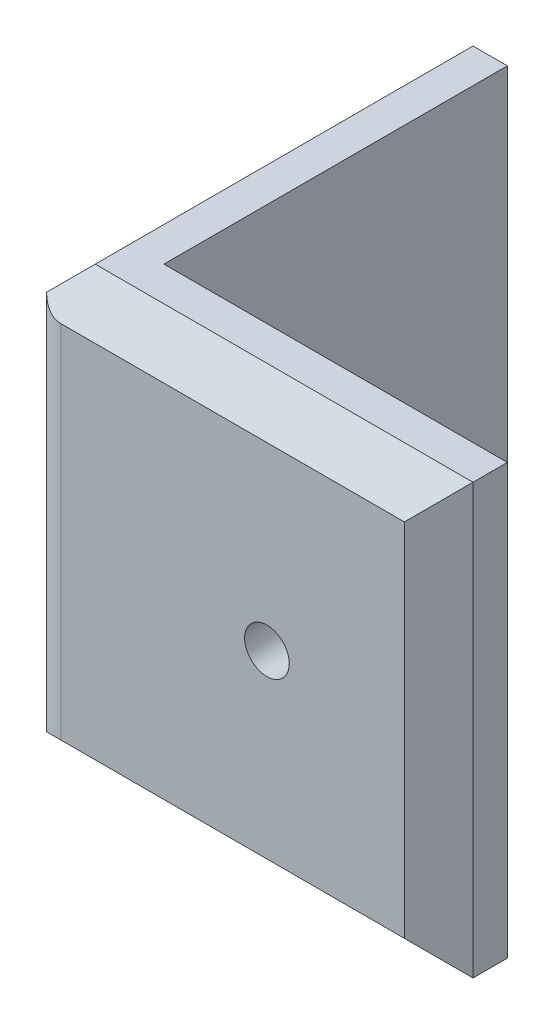
ISO-10303-21;
HEADER;
FILE_DESCRIPTION(('STEP AP214'),'2;1');
FILE_NAME('part.step','',(''),(''),'','','');
FILE_SCHEMA(('AUTOMOTIVE_DESIGN { 1 0 10303 214 1 1 1 1 }'));
ENDSEC;
DATA;
#1=APPLICATION_CONTEXT('core data for automotive mechanical design processes');
#2=APPLICATION_PROTOCOL_DEFINITION('international standard','automotive_design',2000,#1);
#3=PRODUCT_CONTEXT('',#1,'mechanical');
#4=PRODUCT('Part','Part','',(#3));
#5=PRODUCT_RELATED_PRODUCT_CATEGORY('part','',(#4));
#6=PRODUCT_DEFINITION_FORMATION('','',#4);
#7=PRODUCT_DEFINITION_CONTEXT('part definition',#1,'design');
#8=PRODUCT_DEFINITION('design','',#6,#7);
#9=PRODUCT_DEFINITION_SHAPE('','',#8);
#10=(LENGTH_UNIT() NAMED_UNIT(*) SI_UNIT(.MILLI.,.METRE.));
#11=(NAMED_UNIT(*) PLANE_ANGLE_UNIT() SI_UNIT($,.RADIAN.));
#12=(NAMED_UNIT(*) SI_UNIT($,.STERADIAN.) SOLID_ANGLE_UNIT());
#13=UNCERTAINTY_MEASURE_WITH_UNIT(LENGTH_MEASURE(1.E-05),#10,'distance_accuracy_value','');
#14=(GEOMETRIC_REPRESENTATION_CONTEXT(3) GLOBAL_UNCERTAINTY_ASSIGNED_CONTEXT((#13)) GLOBAL_UNIT_ASSIGNED_CONTEXT((#10,
#11,#12)) REPRESENTATION_CONTEXT('',''));
#15=CARTESIAN_POINT('',(0.,0.,0.));
#16=DIRECTION('',(0.,0.,1.));
#17=DIRECTION('',(1.,0.,0.));
#18=AXIS2_PLACEMENT_3D('',#15,#16,#17);
#19=CARTESIAN_POINT('',(-8.,50.,8.));
#20=DIRECTION('',(1.,0.,0.));
#21=DIRECTION('',(0.,0.,-1.));
#22=AXIS2_PLACEMENT_3D('',#19,#20,#21);
#23=PLANE('',#22);
#24=CARTESIAN_POINT('',(-8.,25.,-20.));
#25=DIRECTION('',(-1.,0.,0.));
#26=DIRECTION('',(0.,0.,1.));
#27=AXIS2_PLACEMENT_3D('',#24,#25,#26);
#28=CIRCLE('',#27,2.6);
#29=CARTESIAN_POINT('',(-8.,25.,-17.4));
#30=VERTEX_POINT('',#29);
#31=EDGE_CURVE('E190',#30,#30,#28,.T.);
#32=ORIENTED_EDGE('',*,*,#31,.F.);
#33=EDGE_LOOP('',(#32));
#34=FACE_BOUND('',#33,.T.);
#35=CARTESIAN_POINT('',(-8.,25.,-20.));
#36=DIRECTION('',(-1.,0.,0.));
#37=DIRECTION('',(0.,0.,1.));
#38=AXIS2_PLACEMENT_3D('',#35,#36,#37);
#39=CIRCLE('',#38,5.5);
#40=CARTESIAN_POINT('',(-8.,25.,-14.5));
#41=VERTEX_POINT('',#40);
#42=EDGE_CURVE('E262',#41,#41,#39,.T.);
#43=ORIENTED_EDGE('',*,*,#42,.T.);
#44=EDGE_LOOP('',(#43));
#45=FACE_BOUND('',#44,.T.);
#46=ADVANCED_FACE('F47',(#34,#45),#23,.F.);
#47=CARTESIAN_POINT('',(-8.,25.,-20.));
#48=DIRECTION('',(1.,0.,0.));
#49=DIRECTION('',(0.,0.,-1.));
#50=AXIS2_PLACEMENT_3D('',#47,#48,#49);
#51=CIRCLE('',#50,15.5693079519158);
#52=CARTESIAN_POINT('',(-8.,25.,-35.5693079519158));
#53=VERTEX_POINT('',#52);
#54=EDGE_CURVE('E199',#53,#53,#51,.T.);
#55=ORIENTED_EDGE('',*,*,#54,.T.);
#56=EDGE_LOOP('',(#55));
#57=FACE_BOUND('',#56,.T.);
#58=DIRECTION('',(0.,0.,1.));
#59=VECTOR('',#58,1.);
#60=CARTESIAN_POINT('',(-8.,4.,8.));
#61=LINE('',#60,#59);
#62=CARTESIAN_POINT('',(-8.,4.,-36.));
#63=VERTEX_POINT('',#62);
#64=CARTESIAN_POINT('',(-8.,4.,4.));
#65=VERTEX_POINT('',#64);
#66=EDGE_CURVE('E235',#63,#65,#61,.T.);
#67=ORIENTED_EDGE('',*,*,#66,.T.);
#68=DIRECTION('',(0.,-1.,0.));
#69=VECTOR('',#68,1.);
#70=CARTESIAN_POINT('',(-8.,50.,4.));
#71=LINE('',#70,#69);
#72=CARTESIAN_POINT('',(-8.,46.,4.));
#73=VERTEX_POINT('',#72);
#74=EDGE_CURVE('E70',#65,#73,#71,.F.);
#75=ORIENTED_EDGE('',*,*,#74,.T.);
#76=DIRECTION('',(0.,0.,-1.));
#77=VECTOR('',#76,1.);
#78=CARTESIAN_POINT('',(-8.,46.,8.));
#79=LINE('',#78,#77);
#80=CARTESIAN_POINT('',(-8.,46.,-36.));
#81=VERTEX_POINT('',#80);
#82=EDGE_CURVE('E232',#73,#81,#79,.T.);
#83=ORIENTED_EDGE('',*,*,#82,.T.);
#84=DIRECTION('',(0.,-1.,0.));
#85=VECTOR('',#84,1.);
#86=CARTESIAN_POINT('',(-8.,50.,-36.));
#87=LINE('',#86,#85);
#88=EDGE_CURVE('E229',#81,#63,#87,.T.);
#89=ORIENTED_EDGE('',*,*,#88,.T.);
#90=EDGE_LOOP('',(#67,#75,#83,#89));
#91=FACE_BOUND('',#90,.T.);
#92=ADVANCED_FACE('F281',(#57,#91),#23,.F.);
#93=CARTESIAN_POINT('',(40.,50.,8.));
#94=DIRECTION('',(0.,0.,-1.));
#95=DIRECTION('',(-1.,0.,0.));
#96=AXIS2_PLACEMENT_3D('',#93,#94,#95);
#97=PLANE('',#96);
#98=CARTESIAN_POINT('',(20.,25.,8.));
#99=DIRECTION('',(0.,0.,1.));
#100=DIRECTION('',(1.,0.,0.));
#101=AXIS2_PLACEMENT_3D('',#98,#99,#100);
#102=CIRCLE('',#101,2.6);
#103=CARTESIAN_POINT('',(22.6,25.,8.));
#104=VERTEX_POINT('',#103);
#105=EDGE_CURVE('E195',#104,#104,#102,.T.);
#106=ORIENTED_EDGE('',*,*,#105,.F.);
#107=EDGE_LOOP('',(#106));
#108=FACE_BOUND('',#107,.T.);
#109=DIRECTION('',(-1.,0.,0.));
#110=VECTOR('',#109,1.);
#111=CARTESIAN_POINT('',(40.,46.,8.));
#112=LINE('',#111,#110);
#113=CARTESIAN_POINT('',(36.,46.,8.));
#114=VERTEX_POINT('',#113);
#115=CARTESIAN_POINT('',(-4.,46.,8.));
#116=VERTEX_POINT('',#115);
#117=EDGE_CURVE('E206',#114,#116,#112,.T.);
#118=ORIENTED_EDGE('',*,*,#117,.T.);
#119=DIRECTION('',(0.,-1.,0.));
#120=VECTOR('',#119,1.);
#121=CARTESIAN_POINT('',(-4.,50.,8.));
#122=LINE('',#121,#120);
#123=CARTESIAN_POINT('',(-4.,4.,8.));
#124=VERTEX_POINT('',#123);
#125=EDGE_CURVE('E241',#116,#124,#122,.T.);
#126=ORIENTED_EDGE('',*,*,#125,.T.);
#127=DIRECTION('',(1.,0.,0.));
#128=VECTOR('',#127,1.);
#129=CARTESIAN_POINT('',(40.,4.,8.));
#130=LINE('',#129,#128);
#131=CARTESIAN_POINT('',(36.,4.,8.));
#132=VERTEX_POINT('',#131);
#133=EDGE_CURVE('E214',#124,#132,#130,.T.);
#134=ORIENTED_EDGE('',*,*,#133,.T.);
#135=DIRECTION('',(0.,1.,0.));
#136=VECTOR('',#135,1.);
#137=CARTESIAN_POINT('',(36.,50.,8.));
#138=LINE('',#137,#136);
#139=EDGE_CURVE('E210',#132,#114,#138,.T.);
#140=ORIENTED_EDGE('',*,*,#139,.T.);
#141=EDGE_LOOP('',(#118,#126,#134,#140));
#142=FACE_BOUND('',#141,.T.);
#143=ADVANCED_FACE('F290',(#108,#142),#97,.F.);
#144=CARTESIAN_POINT('',(40.,50.,0.));
#145=DIRECTION('',(-1.,0.,0.));
#146=DIRECTION('',(0.,0.,1.));
#147=AXIS2_PLACEMENT_3D('',#144,#145,#146);
#148=PLANE('',#147);
#149=DIRECTION('',(0.,0.,-1.));
#150=VECTOR('',#149,1.);
#151=CARTESIAN_POINT('',(40.,50.,0.));
#152=LINE('',#151,#150);
#153=CARTESIAN_POINT('',(40.,50.,4.));
#154=VERTEX_POINT('',#153);
#155=CARTESIAN_POINT('',(40.,50.,0.));
#156=VERTEX_POINT('',#155);
#157=EDGE_CURVE('E130',#154,#156,#152,.T.);
#158=ORIENTED_EDGE('',*,*,#157,.F.);
#159=DIRECTION('',(0.,-1.,0.));
#160=VECTOR('',#159,1.);
#161=CARTESIAN_POINT('',(40.,50.,4.));
#162=LINE('',#161,#160);
#163=CARTESIAN_POINT('',(40.,0.,4.));
#164=VERTEX_POINT('',#163);
#165=EDGE_CURVE('E203',#154,#164,#162,.T.);
#166=ORIENTED_EDGE('',*,*,#165,.T.);
#167=DIRECTION('',(0.,0.,-1.));
#168=VECTOR('',#167,1.);
#169=CARTESIAN_POINT('',(40.,0.,0.));
#170=LINE('',#169,#168);
#171=CARTESIAN_POINT('',(40.,0.,0.));
#172=VERTEX_POINT('',#171);
#173=EDGE_CURVE('E148',#164,#172,#170,.T.);
#174=ORIENTED_EDGE('',*,*,#173,.T.);
#175=DIRECTION('',(0.,-1.,0.));
#176=VECTOR('',#175,1.);
#177=CARTESIAN_POINT('',(40.,50.,0.));
#178=LINE('',#177,#176);
#179=EDGE_CURVE('E145',#156,#172,#178,.T.);
#180=ORIENTED_EDGE('',*,*,#179,.F.);
#181=EDGE_LOOP('',(#158,#166,#174,#180));
#182=FACE_BOUND('',#181,.T.);
#183=ADVANCED_FACE('F146',(#182),#148,.F.);
#184=CARTESIAN_POINT('',(0.,50.,0.));
#185=DIRECTION('',(0.,0.,1.));
#186=DIRECTION('',(1.,0.,0.));
#187=AXIS2_PLACEMENT_3D('',#184,#185,#186);
#188=PLANE('',#187);
#189=CARTESIAN_POINT('',(20.,25.,0.));
#190=DIRECTION('',(0.,0.,1.));
#191=DIRECTION('',(1.,0.,0.));
#192=AXIS2_PLACEMENT_3D('',#189,#190,#191);
#193=CIRCLE('',#192,2.6);
#194=CARTESIAN_POINT('',(22.6,25.,0.));
#195=VERTEX_POINT('',#194);
#196=EDGE_CURVE('E191',#195,#195,#193,.T.);
#197=ORIENTED_EDGE('',*,*,#196,.T.);
#198=EDGE_LOOP('',(#197));
#199=FACE_BOUND('',#198,.T.);
#200=DIRECTION('',(-1.,0.,0.));
#201=VECTOR('',#200,1.);
#202=CARTESIAN_POINT('',(0.,0.,0.));
#203=LINE('',#202,#201);
#204=CARTESIAN_POINT('',(0.,0.,0.));
#205=VERTEX_POINT('',#204);
#206=EDGE_CURVE('E172',#172,#205,#203,.T.);
#207=ORIENTED_EDGE('',*,*,#206,.T.);
#208=DIRECTION('',(0.,-1.,0.));
#209=VECTOR('',#208,1.);
#210=CARTESIAN_POINT('',(0.,50.,0.));
#211=LINE('',#210,#209);
#212=CARTESIAN_POINT('',(0.,50.,0.));
#213=VERTEX_POINT('',#212);
#214=EDGE_CURVE('E153',#213,#205,#211,.T.);
#215=ORIENTED_EDGE('',*,*,#214,.F.);
#216=DIRECTION('',(-1.,0.,0.));
#217=VECTOR('',#216,1.);
#218=CARTESIAN_POINT('',(0.,50.,0.));
#219=LINE('',#218,#217);
#220=EDGE_CURVE('E134',#156,#213,#219,.T.);
#221=ORIENTED_EDGE('',*,*,#220,.F.);
#222=ORIENTED_EDGE('',*,*,#179,.T.);
#223=EDGE_LOOP('',(#207,#215,#221,#222));
#224=FACE_BOUND('',#223,.T.);
#225=ADVANCED_FACE('F155',(#199,#224),#188,.F.);
#226=CARTESIAN_POINT('',(0.,50.,-40.));
#227=DIRECTION('',(-1.,0.,0.));
#228=DIRECTION('',(0.,0.,1.));
#229=AXIS2_PLACEMENT_3D('',#226,#227,#228);
#230=PLANE('',#229);
#231=CARTESIAN_POINT('',(0.,25.,-20.));
#232=DIRECTION('',(-1.,0.,0.));
#233=DIRECTION('',(0.,0.,1.));
#234=AXIS2_PLACEMENT_3D('',#231,#232,#233);
#235=CIRCLE('',#234,2.6);
#236=CARTESIAN_POINT('',(0.,25.,-17.4));
#237=VERTEX_POINT('',#236);
#238=EDGE_CURVE('E173',#237,#237,#235,.T.);
#239=ORIENTED_EDGE('',*,*,#238,.T.);
#240=EDGE_LOOP('',(#239));
#241=FACE_BOUND('',#240,.T.);
#242=DIRECTION('',(0.,0.,-1.));
#243=VECTOR('',#242,1.);
#244=CARTESIAN_POINT('',(0.,0.,-40.));
#245=LINE('',#244,#243);
#246=CARTESIAN_POINT('',(0.,0.,-40.));
#247=VERTEX_POINT('',#246);
#248=EDGE_CURVE('E176',#205,#247,#245,.T.);
#249=ORIENTED_EDGE('',*,*,#248,.T.);
#250=DIRECTION('',(0.,-1.,0.));
#251=VECTOR('',#250,1.);
#252=CARTESIAN_POINT('',(0.,50.,-40.));
#253=LINE('',#252,#251);
#254=CARTESIAN_POINT('',(0.,50.,-40.));
#255=VERTEX_POINT('',#254);
#256=EDGE_CURVE('E169',#255,#247,#253,.T.);
#257=ORIENTED_EDGE('',*,*,#256,.F.);
#258=DIRECTION('',(0.,0.,-1.));
#259=VECTOR('',#258,1.);
#260=CARTESIAN_POINT('',(0.,50.,-40.));
#261=LINE('',#260,#259);
#262=EDGE_CURVE('E159',#213,#255,#261,.T.);
#263=ORIENTED_EDGE('',*,*,#262,.F.);
#264=ORIENTED_EDGE('',*,*,#214,.T.);
#265=EDGE_LOOP('',(#249,#257,#263,#264));
#266=FACE_BOUND('',#265,.T.);
#267=ADVANCED_FACE('F305',(#241,#266),#230,.F.);
#268=CARTESIAN_POINT('',(-8.,50.,-40.));
#269=DIRECTION('',(0.,0.,1.));
#270=DIRECTION('',(1.,0.,0.));
#271=AXIS2_PLACEMENT_3D('',#268,#269,#270);
#272=PLANE('',#271);
#273=DIRECTION('',(-1.,0.,0.));
#274=VECTOR('',#273,1.);
#275=CARTESIAN_POINT('',(-8.,0.,-40.));
#276=LINE('',#275,#274);
#277=CARTESIAN_POINT('',(-4.,0.,-40.));
#278=VERTEX_POINT('',#277);
#279=EDGE_CURVE('E142',#247,#278,#276,.T.);
#280=ORIENTED_EDGE('',*,*,#279,.T.);
#281=DIRECTION('',(0.,1.,0.));
#282=VECTOR('',#281,1.);
#283=CARTESIAN_POINT('',(-4.,50.,-40.));
#284=LINE('',#283,#282);
#285=CARTESIAN_POINT('',(-4.,50.,-40.));
#286=VERTEX_POINT('',#285);
#287=EDGE_CURVE('E238',#278,#286,#284,.T.);
#288=ORIENTED_EDGE('',*,*,#287,.T.);
#289=DIRECTION('',(-1.,0.,0.));
#290=VECTOR('',#289,1.);
#291=CARTESIAN_POINT('',(-8.,50.,-40.));
#292=LINE('',#291,#290);
#293=EDGE_CURVE('E162',#255,#286,#292,.T.);
#294=ORIENTED_EDGE('',*,*,#293,.F.);
#295=ORIENTED_EDGE('',*,*,#256,.T.);
#296=EDGE_LOOP('',(#280,#288,#294,#295));
#297=FACE_BOUND('',#296,.T.);
#298=ADVANCED_FACE('F473',(#297),#272,.F.);
#299=CARTESIAN_POINT('',(0.,50.,0.));
#300=DIRECTION('',(0.,-1.,0.));
#301=DIRECTION('',(0.,0.,-1.));
#302=AXIS2_PLACEMENT_3D('',#299,#300,#301);
#303=PLANE('',#302);
#304=DIRECTION('',(0.,0.,1.));
#305=VECTOR('',#304,1.);
#306=CARTESIAN_POINT('',(-4.,50.,0.));
#307=LINE('',#306,#305);
#308=CARTESIAN_POINT('',(-3.99999999999999,50.,4.));
#309=VERTEX_POINT('',#308);
#310=EDGE_CURVE('E224',#286,#309,#307,.T.);
#311=ORIENTED_EDGE('',*,*,#310,.T.);
#312=DIRECTION('',(1.,0.,0.));
#313=VECTOR('',#312,1.);
#314=CARTESIAN_POINT('',(0.,50.,4.));
#315=LINE('',#314,#313);
#316=EDGE_CURVE('E137',#309,#154,#315,.T.);
#317=ORIENTED_EDGE('',*,*,#316,.T.);
#318=ORIENTED_EDGE('',*,*,#157,.T.);
#319=ORIENTED_EDGE('',*,*,#220,.T.);
#320=ORIENTED_EDGE('',*,*,#262,.T.);
#321=ORIENTED_EDGE('',*,*,#293,.T.);
#322=EDGE_LOOP('',(#311,#317,#318,#319,#320,#321));
#323=FACE_BOUND('',#322,.T.);
#324=ADVANCED_FACE('F132',(#323),#303,.F.);
#325=CARTESIAN_POINT('',(0.,0.,0.));
#326=DIRECTION('',(0.,-1.,0.));
#327=DIRECTION('',(0.,0.,-1.));
#328=AXIS2_PLACEMENT_3D('',#325,#326,#327);
#329=PLANE('',#328);
#330=ORIENTED_EDGE('',*,*,#173,.F.);
#331=DIRECTION('',(-1.,0.,0.));
#332=VECTOR('',#331,1.);
#333=CARTESIAN_POINT('',(-8.,0.,4.));
#334=LINE('',#333,#332);
#335=CARTESIAN_POINT('',(-3.99999999999999,0.,4.));
#336=VERTEX_POINT('',#335);
#337=EDGE_CURVE('E220',#164,#336,#334,.T.);
#338=ORIENTED_EDGE('',*,*,#337,.T.);
#339=DIRECTION('',(0.,0.,-1.));
#340=VECTOR('',#339,1.);
#341=CARTESIAN_POINT('',(-4.,0.,-40.));
#342=LINE('',#341,#340);
#343=EDGE_CURVE('E217',#336,#278,#342,.T.);
#344=ORIENTED_EDGE('',*,*,#343,.T.);
#345=ORIENTED_EDGE('',*,*,#279,.F.);
#346=ORIENTED_EDGE('',*,*,#248,.F.);
#347=ORIENTED_EDGE('',*,*,#206,.F.);
#348=EDGE_LOOP('',(#330,#338,#344,#345,#346,#347));
#349=FACE_BOUND('',#348,.T.);
#350=ADVANCED_FACE('F301',(#349),#329,.T.);
#351=CARTESIAN_POINT('',(40.,25.,-20.));
#352=DIRECTION('',(-1.,0.,0.));
#353=DIRECTION('',(0.,0.,1.));
#354=AXIS2_PLACEMENT_3D('',#351,#352,#353);
#355=CYLINDRICAL_SURFACE('',#354,2.6);
#356=ORIENTED_EDGE('',*,*,#31,.T.);
#357=EDGE_LOOP('',(#356));
#358=FACE_BOUND('',#357,.T.);
#359=ORIENTED_EDGE('',*,*,#238,.F.);
#360=EDGE_LOOP('',(#359));
#361=FACE_BOUND('',#360,.T.);
#362=ADVANCED_FACE('F448',(#358,#361),#355,.F.);
#363=CARTESIAN_POINT('',(20.,25.,-40.));
#364=DIRECTION('',(0.,0.,1.));
#365=DIRECTION('',(1.,0.,0.));
#366=AXIS2_PLACEMENT_3D('',#363,#364,#365);
#367=CYLINDRICAL_SURFACE('',#366,2.6);
#368=ORIENTED_EDGE('',*,*,#105,.T.);
#369=EDGE_LOOP('',(#368));
#370=FACE_BOUND('',#369,.T.);
#371=ORIENTED_EDGE('',*,*,#196,.F.);
#372=EDGE_LOOP('',(#371));
#373=FACE_BOUND('',#372,.T.);
#374=ADVANCED_FACE('F435',(#370,#373),#367,.F.);
#375=CARTESIAN_POINT('',(-16.,25.,-20.));
#376=DIRECTION('',(-1.,0.,0.));
#377=DIRECTION('',(0.,0.,1.));
#378=AXIS2_PLACEMENT_3D('',#375,#376,#377);
#379=PLANE('',#378);
#380=CARTESIAN_POINT('',(-16.,25.,-20.));
#381=DIRECTION('',(-1.,0.,0.));
#382=DIRECTION('',(0.,0.,1.));
#383=AXIS2_PLACEMENT_3D('',#380,#381,#382);
#384=CIRCLE('',#383,10.356406460551);
#385=CARTESIAN_POINT('',(-16.,25.,-9.64359353944899));
#386=VERTEX_POINT('',#385);
#387=EDGE_CURVE('E529',#386,#386,#384,.T.);
#388=ORIENTED_EDGE('',*,*,#387,.T.);
#389=EDGE_LOOP('',(#388));
#390=FACE_BOUND('',#389,.T.);
#391=CARTESIAN_POINT('',(-16.,25.,-20.));
#392=DIRECTION('',(-1.,0.,0.));
#393=DIRECTION('',(0.,0.,1.));
#394=AXIS2_PLACEMENT_3D('',#391,#392,#393);
#395=CIRCLE('',#394,7.64359353944899);
#396=CARTESIAN_POINT('',(-16.,25.,-12.356406460551));
#397=VERTEX_POINT('',#396);
#398=EDGE_CURVE('E533',#397,#397,#395,.T.);
#399=ORIENTED_EDGE('',*,*,#398,.F.);
#400=EDGE_LOOP('',(#399));
#401=FACE_BOUND('',#400,.T.);
#402=ADVANCED_FACE('F427',(#390,#401),#379,.T.);
#403=CARTESIAN_POINT('',(-8.,25.,-20.));
#404=DIRECTION('',(1.,0.,0.));
#405=DIRECTION('',(0.,0.,1.));
#406=AXIS2_PLACEMENT_3D('',#403,#404,#405);
#407=CONICAL_SURFACE('',#406,12.5,0.26179938779915);
#408=CARTESIAN_POINT('',(-10.9647238195899,25.,-20.));
#409=DIRECTION('',(1.,0.,0.));
#410=DIRECTION('',(0.,0.,-1.));
#411=AXIS2_PLACEMENT_3D('',#408,#409,#410);
#412=CIRCLE('',#411,11.7056046467596);
#413=CARTESIAN_POINT('',(-10.9647238195899,25.,-31.7056046467596));
#414=VERTEX_POINT('',#413);
#415=EDGE_CURVE('E152',#414,#414,#412,.F.);
#416=ORIENTED_EDGE('',*,*,#415,.T.);
#417=EDGE_LOOP('',(#416));
#418=FACE_BOUND('',#417,.T.);
#419=ORIENTED_EDGE('',*,*,#387,.F.);
#420=EDGE_LOOP('',(#419));
#421=FACE_BOUND('',#420,.T.);
#422=ADVANCED_FACE('F418',(#418,#421),#407,.T.);
#423=CARTESIAN_POINT('',(-8.,25.,-20.));
#424=DIRECTION('',(-1.,0.,0.));
#425=DIRECTION('',(0.,0.,1.));
#426=AXIS2_PLACEMENT_3D('',#423,#424,#425);
#427=CONICAL_SURFACE('',#426,5.5,0.26179938779915);
#428=ORIENTED_EDGE('',*,*,#398,.T.);
#429=EDGE_LOOP('',(#428));
#430=FACE_BOUND('',#429,.T.);
#431=ORIENTED_EDGE('',*,*,#42,.F.);
#432=EDGE_LOOP('',(#431));
#433=FACE_BOUND('',#432,.T.);
#434=ADVANCED_FACE('F338',(#430,#433),#427,.F.);
#435=CARTESIAN_POINT('',(-12.,25.,-20.));
#436=DIRECTION('',(1.,0.,0.));
#437=DIRECTION('',(0.,0.,-1.));
#438=AXIS2_PLACEMENT_3D('',#435,#436,#437);
#439=TOROIDAL_SURFACE('',#438,15.5693079519158,4.);
#440=ORIENTED_EDGE('',*,*,#54,.F.);
#441=EDGE_LOOP('',(#440));
#442=FACE_BOUND('',#441,.T.);
#443=ORIENTED_EDGE('',*,*,#415,.F.);
#444=EDGE_LOOP('',(#443));
#445=FACE_BOUND('',#444,.T.);
#446=ADVANCED_FACE('F322',(#442,#445),#439,.F.);
#447=CARTESIAN_POINT('',(-8.,50.,-36.));
#448=DIRECTION('',(0.707106781186548,0.,0.707106781186547));
#449=DIRECTION('',(0.,-1.,0.));
#450=AXIS2_PLACEMENT_3D('',#447,#448,#449);
#451=PLANE('',#450);
#452=DIRECTION('',(0.577350269189625,-0.577350269189626,-0.577350269189626));
#453=VECTOR('',#452,1.);
#454=CARTESIAN_POINT('',(-23.3333333333333,19.3333333333333,-20.6666666666666));
#455=LINE('',#454,#453);
#456=EDGE_CURVE('E254',#63,#278,#455,.T.);
#457=ORIENTED_EDGE('',*,*,#456,.F.);
#458=ORIENTED_EDGE('',*,*,#88,.F.);
#459=DIRECTION('',(0.577350269189625,0.577350269189626,-0.577350269189626));
#460=VECTOR('',#459,1.);
#461=CARTESIAN_POINT('',(-6.66666666666667,47.3333333333333,-37.3333333333333));
#462=LINE('',#461,#460);
#463=EDGE_CURVE('E258',#286,#81,#462,.F.);
#464=ORIENTED_EDGE('',*,*,#463,.F.);
#465=ORIENTED_EDGE('',*,*,#287,.F.);
#466=EDGE_LOOP('',(#457,#458,#464,#465));
#467=FACE_BOUND('',#466,.T.);
#468=ADVANCED_FACE('F313',(#467),#451,.F.);
#469=CARTESIAN_POINT('',(-4.,50.,0.));
#470=DIRECTION('',(0.707106781186547,-0.707106781186547,0.));
#471=DIRECTION('',(0.,0.,1.));
#472=AXIS2_PLACEMENT_3D('',#469,#470,#471);
#473=PLANE('',#472);
#474=ORIENTED_EDGE('',*,*,#82,.F.);
#475=CARTESIAN_POINT('',(-4.,50.,4.));
#476=DIRECTION('',(0.707106781186547,-0.707106781186547,0.));
#477=DIRECTION('',(-0.707106781186548,-0.707106781186548,0.));
#478=AXIS2_PLACEMENT_3D('',#475,#476,#477);
#479=ELLIPSE('',#478,5.65685424949238,4.);
#480=CARTESIAN_POINT('',(-6.82842712474618,47.1715728752538,6.82842712474619));
#481=VERTEX_POINT('',#480);
#482=EDGE_CURVE('E56',#73,#481,#479,.F.);
#483=ORIENTED_EDGE('',*,*,#482,.T.);
#484=DIRECTION('',(0.577350269189626,0.577350269189626,-0.577350269189626));
#485=VECTOR('',#484,1.);
#486=CARTESIAN_POINT('',(-2.66666666666666,51.3333333333333,2.66666666666667));
#487=LINE('',#486,#485);
#488=EDGE_CURVE('E251',#309,#481,#487,.F.);
#489=ORIENTED_EDGE('',*,*,#488,.F.);
#490=ORIENTED_EDGE('',*,*,#310,.F.);
#491=ORIENTED_EDGE('',*,*,#463,.T.);
#492=EDGE_LOOP('',(#474,#483,#489,#490,#491));
#493=FACE_BOUND('',#492,.T.);
#494=ADVANCED_FACE('F314',(#493),#473,.F.);
#495=CARTESIAN_POINT('',(-8.,4.,8.));
#496=DIRECTION('',(-0.707106781186547,-0.707106781186547,0.));
#497=DIRECTION('',(0.,0.,-1.));
#498=AXIS2_PLACEMENT_3D('',#495,#496,#497);
#499=PLANE('',#498);
#500=DIRECTION('',(-0.577350269189626,0.577350269189626,0.577350269189626));
#501=VECTOR('',#500,1.);
#502=CARTESIAN_POINT('',(-8.,4.,8.));
#503=LINE('',#502,#501);
#504=CARTESIAN_POINT('',(-6.82842712474619,2.82842712474619,6.82842712474619));
#505=VERTEX_POINT('',#504);
#506=EDGE_CURVE('E248',#505,#336,#503,.F.);
#507=ORIENTED_EDGE('',*,*,#506,.F.);
#508=CARTESIAN_POINT('',(-4.,0.,4.));
#509=DIRECTION('',(-0.707106781186547,-0.707106781186547,0.));
#510=DIRECTION('',(0.707106781186548,-0.707106781186548,0.));
#511=AXIS2_PLACEMENT_3D('',#508,#509,#510);
#512=ELLIPSE('',#511,5.65685424949238,4.);
#513=EDGE_CURVE('E269',#505,#65,#512,.T.);
#514=ORIENTED_EDGE('',*,*,#513,.T.);
#515=ORIENTED_EDGE('',*,*,#66,.F.);
#516=ORIENTED_EDGE('',*,*,#456,.T.);
#517=ORIENTED_EDGE('',*,*,#343,.F.);
#518=EDGE_LOOP('',(#507,#514,#515,#516,#517));
#519=FACE_BOUND('',#518,.T.);
#520=ADVANCED_FACE('F278',(#519),#499,.T.);
#521=CARTESIAN_POINT('',(0.,50.,4.));
#522=DIRECTION('',(0.,-0.707106781186547,-0.707106781186547));
#523=DIRECTION('',(1.,0.,0.));
#524=AXIS2_PLACEMENT_3D('',#521,#522,#523);
#525=PLANE('',#524);
#526=ORIENTED_EDGE('',*,*,#488,.T.);
#527=CARTESIAN_POINT('',(-4.,50.,4.));
#528=DIRECTION('',(0.,-0.707106781186547,-0.707106781186547));
#529=DIRECTION('',(0.,-0.707106781186548,0.707106781186548));
#530=AXIS2_PLACEMENT_3D('',#527,#528,#529);
#531=ELLIPSE('',#530,5.65685424949238,4.);
#532=EDGE_CURVE('E12',#481,#116,#531,.F.);
#533=ORIENTED_EDGE('',*,*,#532,.T.);
#534=ORIENTED_EDGE('',*,*,#117,.F.);
#535=DIRECTION('',(0.577350269189626,0.577350269189626,-0.577350269189626));
#536=VECTOR('',#535,1.);
#537=CARTESIAN_POINT('',(26.6666666666667,36.6666666666667,17.3333333333333));
#538=LINE('',#537,#536);
#539=EDGE_CURVE('E245',#154,#114,#538,.F.);
#540=ORIENTED_EDGE('',*,*,#539,.F.);
#541=ORIENTED_EDGE('',*,*,#316,.F.);
#542=EDGE_LOOP('',(#526,#533,#534,#540,#541));
#543=FACE_BOUND('',#542,.T.);
#544=ADVANCED_FACE('F288',(#543),#525,.F.);
#545=CARTESIAN_POINT('',(40.,4.,8.));
#546=DIRECTION('',(0.,-0.707106781186547,0.707106781186547));
#547=DIRECTION('',(-1.,0.,0.));
#548=AXIS2_PLACEMENT_3D('',#545,#546,#547);
#549=PLANE('',#548);
#550=ORIENTED_EDGE('',*,*,#133,.F.);
#551=CARTESIAN_POINT('',(-4.,0.,4.));
#552=DIRECTION('',(0.,-0.707106781186547,0.707106781186547));
#553=DIRECTION('',(0.,-0.707106781186548,-0.707106781186548));
#554=AXIS2_PLACEMENT_3D('',#551,#552,#553);
#555=ELLIPSE('',#554,5.65685424949238,4.);
#556=EDGE_CURVE('E266',#124,#505,#555,.T.);
#557=ORIENTED_EDGE('',*,*,#556,.T.);
#558=ORIENTED_EDGE('',*,*,#506,.T.);
#559=ORIENTED_EDGE('',*,*,#337,.F.);
#560=DIRECTION('',(0.577350269189626,-0.577350269189626,-0.577350269189626));
#561=VECTOR('',#560,1.);
#562=CARTESIAN_POINT('',(37.3333333333333,2.66666666666667,6.66666666666667));
#563=LINE('',#562,#561);
#564=EDGE_CURVE('E242',#132,#164,#563,.T.);
#565=ORIENTED_EDGE('',*,*,#564,.F.);
#566=EDGE_LOOP('',(#550,#557,#558,#559,#565));
#567=FACE_BOUND('',#566,.T.);
#568=ADVANCED_FACE('F299',(#567),#549,.T.);
#569=CARTESIAN_POINT('',(40.,50.,4.));
#570=DIRECTION('',(-0.707106781186547,0.,-0.707106781186547));
#571=DIRECTION('',(0.,-1.,0.));
#572=AXIS2_PLACEMENT_3D('',#569,#570,#571);
#573=PLANE('',#572);
#574=ORIENTED_EDGE('',*,*,#539,.T.);
#575=ORIENTED_EDGE('',*,*,#139,.F.);
#576=ORIENTED_EDGE('',*,*,#564,.T.);
#577=ORIENTED_EDGE('',*,*,#165,.F.);
#578=EDGE_LOOP('',(#574,#575,#576,#577));
#579=FACE_BOUND('',#578,.T.);
#580=ADVANCED_FACE('F295',(#579),#573,.F.);
#581=CARTESIAN_POINT('',(-4.,50.,4.));
#582=DIRECTION('',(0.,-1.,0.));
#583=DIRECTION('',(0.,0.,-1.));
#584=AXIS2_PLACEMENT_3D('',#581,#582,#583);
#585=CYLINDRICAL_SURFACE('',#584,4.);
#586=ORIENTED_EDGE('',*,*,#482,.F.);
#587=ORIENTED_EDGE('',*,*,#74,.F.);
#588=ORIENTED_EDGE('',*,*,#513,.F.);
#589=ORIENTED_EDGE('',*,*,#556,.F.);
#590=ORIENTED_EDGE('',*,*,#125,.F.);
#591=ORIENTED_EDGE('',*,*,#532,.F.);
#592=EDGE_LOOP('',(#586,#587,#588,#589,#590,#591));
#593=FACE_BOUND('',#592,.T.);
#594=ADVANCED_FACE('F49',(#593),#585,.T.);
#595=CLOSED_SHELL('',(#46,#92,#143,#183,#225,#267,#298,#324,#350,#362,#374,#402,#422,#434,#446,
#468,#494,#520,#544,#568,#580,#594));
#596=MANIFOLD_SOLID_BREP('B2',#595);
#597=ADVANCED_BREP_SHAPE_REPRESENTATION('',(#18,#596),#14);
#598=SHAPE_DEFINITION_REPRESENTATION(#9,#597);
ENDSEC;
END-ISO-10303-21;
